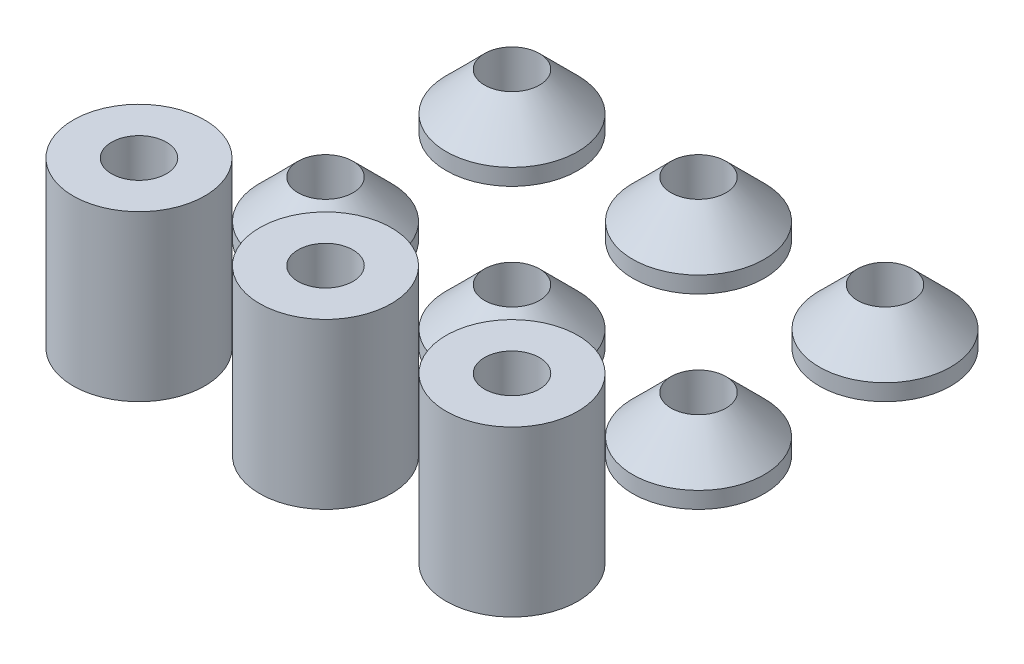
ISO-10303-21;
HEADER;
FILE_DESCRIPTION(('STEP AP214'),'2;1');
FILE_NAME('part.step','',(''),(''),'','','');
FILE_SCHEMA(('AUTOMOTIVE_DESIGN { 1 0 10303 214 1 1 1 1 }'));
ENDSEC;
DATA;
#1=APPLICATION_CONTEXT('core data for automotive mechanical design processes');
#2=APPLICATION_PROTOCOL_DEFINITION('international standard','automotive_design',2000,#1);
#3=PRODUCT_CONTEXT('',#1,'mechanical');
#4=PRODUCT('Part','Part','',(#3));
#5=PRODUCT_RELATED_PRODUCT_CATEGORY('part','',(#4));
#6=PRODUCT_DEFINITION_FORMATION('','',#4);
#7=PRODUCT_DEFINITION_CONTEXT('part definition',#1,'design');
#8=PRODUCT_DEFINITION('design','',#6,#7);
#9=PRODUCT_DEFINITION_SHAPE('','',#8);
#10=(LENGTH_UNIT() NAMED_UNIT(*) SI_UNIT(.MILLI.,.METRE.));
#11=(NAMED_UNIT(*) PLANE_ANGLE_UNIT() SI_UNIT($,.RADIAN.));
#12=(NAMED_UNIT(*) SI_UNIT($,.STERADIAN.) SOLID_ANGLE_UNIT());
#13=UNCERTAINTY_MEASURE_WITH_UNIT(LENGTH_MEASURE(1.E-05),#10,'distance_accuracy_value','');
#14=(GEOMETRIC_REPRESENTATION_CONTEXT(3) GLOBAL_UNCERTAINTY_ASSIGNED_CONTEXT((#13)) GLOBAL_UNIT_ASSIGNED_CONTEXT((#10,
#11,#12)) REPRESENTATION_CONTEXT('',''));
#15=CARTESIAN_POINT('',(0.,0.,0.));
#16=DIRECTION('',(0.,0.,1.));
#17=DIRECTION('',(1.,0.,0.));
#18=AXIS2_PLACEMENT_3D('',#15,#16,#17);
#19=CARTESIAN_POINT('',(20.4780084249292,15.,34.));
#20=DIRECTION('',(0.,1.,0.));
#21=DIRECTION('',(0.,0.,1.));
#22=AXIS2_PLACEMENT_3D('',#19,#20,#21);
#23=PLANE('',#22);
#24=CARTESIAN_POINT('',(20.4780084249292,15.,34.));
#25=DIRECTION('',(0.,1.,0.));
#26=DIRECTION('',(0.,0.,1.));
#27=AXIS2_PLACEMENT_3D('',#24,#25,#26);
#28=CIRCLE('',#27,6.);
#29=CARTESIAN_POINT('',(20.4780084249292,15.,40.));
#30=VERTEX_POINT('',#29);
#31=EDGE_CURVE('E11',#30,#30,#28,.T.);
#32=ORIENTED_EDGE('',*,*,#31,.T.);
#33=EDGE_LOOP('',(#32));
#34=FACE_BOUND('',#33,.T.);
#35=CARTESIAN_POINT('',(20.4780084249292,15.,34.));
#36=DIRECTION('',(0.,1.,0.));
#37=DIRECTION('',(0.,0.,1.));
#38=AXIS2_PLACEMENT_3D('',#35,#36,#37);
#39=CIRCLE('',#38,2.5);
#40=CARTESIAN_POINT('',(20.4780084249292,15.,36.5));
#41=VERTEX_POINT('',#40);
#42=EDGE_CURVE('E57',#41,#41,#39,.T.);
#43=ORIENTED_EDGE('',*,*,#42,.F.);
#44=EDGE_LOOP('',(#43));
#45=FACE_BOUND('',#44,.T.);
#46=ADVANCED_FACE('F46',(#34,#45),#23,.T.);
#47=CARTESIAN_POINT('',(20.4780084249292,0.,34.));
#48=DIRECTION('',(0.,1.,0.));
#49=DIRECTION('',(0.,0.,1.));
#50=AXIS2_PLACEMENT_3D('',#47,#48,#49);
#51=PLANE('',#50);
#52=CARTESIAN_POINT('',(20.4780084249292,0.,34.));
#53=DIRECTION('',(0.,1.,0.));
#54=DIRECTION('',(0.,0.,1.));
#55=AXIS2_PLACEMENT_3D('',#52,#53,#54);
#56=CIRCLE('',#55,6.);
#57=CARTESIAN_POINT('',(20.4780084249292,0.,40.));
#58=VERTEX_POINT('',#57);
#59=EDGE_CURVE('E50',#58,#58,#56,.T.);
#60=ORIENTED_EDGE('',*,*,#59,.F.);
#61=EDGE_LOOP('',(#60));
#62=FACE_BOUND('',#61,.T.);
#63=CARTESIAN_POINT('',(20.4780084249292,0.,34.));
#64=DIRECTION('',(0.,1.,0.));
#65=DIRECTION('',(0.,0.,1.));
#66=AXIS2_PLACEMENT_3D('',#63,#64,#65);
#67=CIRCLE('',#66,2.5);
#68=CARTESIAN_POINT('',(20.4780084249292,0.,36.5));
#69=VERTEX_POINT('',#68);
#70=EDGE_CURVE('E59',#69,#69,#67,.T.);
#71=ORIENTED_EDGE('',*,*,#70,.T.);
#72=EDGE_LOOP('',(#71));
#73=FACE_BOUND('',#72,.T.);
#74=ADVANCED_FACE('F69',(#62,#73),#51,.F.);
#75=CARTESIAN_POINT('',(20.4780084249292,15.,34.));
#76=DIRECTION('',(0.,-1.,0.));
#77=DIRECTION('',(0.,0.,-1.));
#78=AXIS2_PLACEMENT_3D('',#75,#76,#77);
#79=CYLINDRICAL_SURFACE('',#78,6.);
#80=ORIENTED_EDGE('',*,*,#31,.F.);
#81=EDGE_LOOP('',(#80));
#82=FACE_BOUND('',#81,.T.);
#83=ORIENTED_EDGE('',*,*,#59,.T.);
#84=EDGE_LOOP('',(#83));
#85=FACE_BOUND('',#84,.T.);
#86=ADVANCED_FACE('F48',(#82,#85),#79,.T.);
#87=CARTESIAN_POINT('',(20.4780084249292,15.,34.));
#88=DIRECTION('',(0.,-1.,0.));
#89=DIRECTION('',(0.,0.,-1.));
#90=AXIS2_PLACEMENT_3D('',#87,#88,#89);
#91=CYLINDRICAL_SURFACE('',#90,2.5);
#92=ORIENTED_EDGE('',*,*,#42,.T.);
#93=EDGE_LOOP('',(#92));
#94=FACE_BOUND('',#93,.T.);
#95=ORIENTED_EDGE('',*,*,#70,.F.);
#96=EDGE_LOOP('',(#95));
#97=FACE_BOUND('',#96,.T.);
#98=ADVANCED_FACE('F65',(#94,#97),#91,.F.);
#99=CLOSED_SHELL('',(#46,#74,#86,#98));
#100=MANIFOLD_SOLID_BREP('B2',#99);
#101=CARTESIAN_POINT('',(3.47800842492918,15.,34.));
#102=DIRECTION('',(0.,1.,0.));
#103=DIRECTION('',(0.,0.,1.));
#104=AXIS2_PLACEMENT_3D('',#101,#102,#103);
#105=PLANE('',#104);
#106=CARTESIAN_POINT('',(3.47800842492918,15.,34.));
#107=DIRECTION('',(0.,1.,0.));
#108=DIRECTION('',(0.,0.,1.));
#109=AXIS2_PLACEMENT_3D('',#106,#107,#108);
#110=CIRCLE('',#109,6.);
#111=CARTESIAN_POINT('',(3.47800842492918,15.,40.));
#112=VERTEX_POINT('',#111);
#113=EDGE_CURVE('E45',#112,#112,#110,.T.);
#114=ORIENTED_EDGE('',*,*,#113,.T.);
#115=EDGE_LOOP('',(#114));
#116=FACE_BOUND('',#115,.T.);
#117=CARTESIAN_POINT('',(3.47800842492918,15.,34.));
#118=DIRECTION('',(0.,1.,0.));
#119=DIRECTION('',(0.,0.,1.));
#120=AXIS2_PLACEMENT_3D('',#117,#118,#119);
#121=CIRCLE('',#120,2.5);
#122=CARTESIAN_POINT('',(3.47800842492918,15.,36.5));
#123=VERTEX_POINT('',#122);
#124=EDGE_CURVE('E129',#123,#123,#121,.T.);
#125=ORIENTED_EDGE('',*,*,#124,.F.);
#126=EDGE_LOOP('',(#125));
#127=FACE_BOUND('',#126,.T.);
#128=ADVANCED_FACE('F116',(#116,#127),#105,.T.);
#129=CARTESIAN_POINT('',(3.47800842492918,0.,34.));
#130=DIRECTION('',(0.,1.,0.));
#131=DIRECTION('',(0.,0.,1.));
#132=AXIS2_PLACEMENT_3D('',#129,#130,#131);
#133=PLANE('',#132);
#134=CARTESIAN_POINT('',(3.47800842492918,0.,34.));
#135=DIRECTION('',(0.,1.,0.));
#136=DIRECTION('',(0.,0.,1.));
#137=AXIS2_PLACEMENT_3D('',#134,#135,#136);
#138=CIRCLE('',#137,6.);
#139=CARTESIAN_POINT('',(3.47800842492918,0.,40.));
#140=VERTEX_POINT('',#139);
#141=EDGE_CURVE('E120',#140,#140,#138,.T.);
#142=ORIENTED_EDGE('',*,*,#141,.F.);
#143=EDGE_LOOP('',(#142));
#144=FACE_BOUND('',#143,.T.);
#145=CARTESIAN_POINT('',(3.47800842492918,0.,34.));
#146=DIRECTION('',(0.,1.,0.));
#147=DIRECTION('',(0.,0.,1.));
#148=AXIS2_PLACEMENT_3D('',#145,#146,#147);
#149=CIRCLE('',#148,2.5);
#150=CARTESIAN_POINT('',(3.47800842492918,0.,36.5));
#151=VERTEX_POINT('',#150);
#152=EDGE_CURVE('E131',#151,#151,#149,.T.);
#153=ORIENTED_EDGE('',*,*,#152,.T.);
#154=EDGE_LOOP('',(#153));
#155=FACE_BOUND('',#154,.T.);
#156=ADVANCED_FACE('F143',(#144,#155),#133,.F.);
#157=CARTESIAN_POINT('',(3.47800842492918,15.,34.));
#158=DIRECTION('',(0.,-1.,0.));
#159=DIRECTION('',(0.,0.,-1.));
#160=AXIS2_PLACEMENT_3D('',#157,#158,#159);
#161=CYLINDRICAL_SURFACE('',#160,6.);
#162=ORIENTED_EDGE('',*,*,#113,.F.);
#163=EDGE_LOOP('',(#162));
#164=FACE_BOUND('',#163,.T.);
#165=ORIENTED_EDGE('',*,*,#141,.T.);
#166=EDGE_LOOP('',(#165));
#167=FACE_BOUND('',#166,.T.);
#168=ADVANCED_FACE('F118',(#164,#167),#161,.T.);
#169=CARTESIAN_POINT('',(3.47800842492918,15.,34.));
#170=DIRECTION('',(0.,-1.,0.));
#171=DIRECTION('',(0.,0.,-1.));
#172=AXIS2_PLACEMENT_3D('',#169,#170,#171);
#173=CYLINDRICAL_SURFACE('',#172,2.5);
#174=ORIENTED_EDGE('',*,*,#124,.T.);
#175=EDGE_LOOP('',(#174));
#176=FACE_BOUND('',#175,.T.);
#177=ORIENTED_EDGE('',*,*,#152,.F.);
#178=EDGE_LOOP('',(#177));
#179=FACE_BOUND('',#178,.T.);
#180=ADVANCED_FACE('F139',(#176,#179),#173,.F.);
#181=CLOSED_SHELL('',(#128,#156,#168,#180));
#182=MANIFOLD_SOLID_BREP('B6',#181);
#183=CARTESIAN_POINT('',(-13.5219915750708,15.,34.));
#184=DIRECTION('',(0.,1.,0.));
#185=DIRECTION('',(0.,0.,1.));
#186=AXIS2_PLACEMENT_3D('',#183,#184,#185);
#187=PLANE('',#186);
#188=CARTESIAN_POINT('',(-13.5219915750708,15.,34.));
#189=DIRECTION('',(0.,1.,0.));
#190=DIRECTION('',(0.,0.,1.));
#191=AXIS2_PLACEMENT_3D('',#188,#189,#190);
#192=CIRCLE('',#191,6.);
#193=CARTESIAN_POINT('',(-13.5219915750708,15.,40.));
#194=VERTEX_POINT('',#193);
#195=EDGE_CURVE('E115',#194,#194,#192,.T.);
#196=ORIENTED_EDGE('',*,*,#195,.T.);
#197=EDGE_LOOP('',(#196));
#198=FACE_BOUND('',#197,.T.);
#199=CARTESIAN_POINT('',(-13.5219915750708,15.,34.));
#200=DIRECTION('',(0.,1.,0.));
#201=DIRECTION('',(0.,0.,1.));
#202=AXIS2_PLACEMENT_3D('',#199,#200,#201);
#203=CIRCLE('',#202,2.5);
#204=CARTESIAN_POINT('',(-13.5219915750708,15.,36.5));
#205=VERTEX_POINT('',#204);
#206=EDGE_CURVE('E201',#205,#205,#203,.T.);
#207=ORIENTED_EDGE('',*,*,#206,.F.);
#208=EDGE_LOOP('',(#207));
#209=FACE_BOUND('',#208,.T.);
#210=ADVANCED_FACE('F190',(#198,#209),#187,.T.);
#211=CARTESIAN_POINT('',(-13.5219915750708,0.,34.));
#212=DIRECTION('',(0.,1.,0.));
#213=DIRECTION('',(0.,0.,1.));
#214=AXIS2_PLACEMENT_3D('',#211,#212,#213);
#215=PLANE('',#214);
#216=CARTESIAN_POINT('',(-13.5219915750708,0.,34.));
#217=DIRECTION('',(0.,1.,0.));
#218=DIRECTION('',(0.,0.,1.));
#219=AXIS2_PLACEMENT_3D('',#216,#217,#218);
#220=CIRCLE('',#219,6.);
#221=CARTESIAN_POINT('',(-13.5219915750708,0.,40.));
#222=VERTEX_POINT('',#221);
#223=EDGE_CURVE('E194',#222,#222,#220,.T.);
#224=ORIENTED_EDGE('',*,*,#223,.F.);
#225=EDGE_LOOP('',(#224));
#226=FACE_BOUND('',#225,.T.);
#227=CARTESIAN_POINT('',(-13.5219915750708,0.,34.));
#228=DIRECTION('',(0.,1.,0.));
#229=DIRECTION('',(0.,0.,1.));
#230=AXIS2_PLACEMENT_3D('',#227,#228,#229);
#231=CIRCLE('',#230,2.5);
#232=CARTESIAN_POINT('',(-13.5219915750708,0.,36.5));
#233=VERTEX_POINT('',#232);
#234=EDGE_CURVE('E203',#233,#233,#231,.T.);
#235=ORIENTED_EDGE('',*,*,#234,.T.);
#236=EDGE_LOOP('',(#235));
#237=FACE_BOUND('',#236,.T.);
#238=ADVANCED_FACE('F213',(#226,#237),#215,.F.);
#239=CARTESIAN_POINT('',(-13.5219915750708,15.,34.));
#240=DIRECTION('',(0.,-1.,0.));
#241=DIRECTION('',(0.,0.,-1.));
#242=AXIS2_PLACEMENT_3D('',#239,#240,#241);
#243=CYLINDRICAL_SURFACE('',#242,6.);
#244=ORIENTED_EDGE('',*,*,#195,.F.);
#245=EDGE_LOOP('',(#244));
#246=FACE_BOUND('',#245,.T.);
#247=ORIENTED_EDGE('',*,*,#223,.T.);
#248=EDGE_LOOP('',(#247));
#249=FACE_BOUND('',#248,.T.);
#250=ADVANCED_FACE('F192',(#246,#249),#243,.T.);
#251=CARTESIAN_POINT('',(-13.5219915750708,15.,34.));
#252=DIRECTION('',(0.,-1.,0.));
#253=DIRECTION('',(0.,0.,-1.));
#254=AXIS2_PLACEMENT_3D('',#251,#252,#253);
#255=CYLINDRICAL_SURFACE('',#254,2.5);
#256=ORIENTED_EDGE('',*,*,#206,.T.);
#257=EDGE_LOOP('',(#256));
#258=FACE_BOUND('',#257,.T.);
#259=ORIENTED_EDGE('',*,*,#234,.F.);
#260=EDGE_LOOP('',(#259));
#261=FACE_BOUND('',#260,.T.);
#262=ADVANCED_FACE('F209',(#258,#261),#255,.F.);
#263=CLOSED_SHELL('',(#210,#238,#250,#262));
#264=MANIFOLD_SOLID_BREP('B40',#263);
#265=CARTESIAN_POINT('',(20.4780084249292,4.,17.));
#266=DIRECTION('',(0.,-1.,0.));
#267=DIRECTION('',(0.,0.,-1.));
#268=AXIS2_PLACEMENT_3D('',#265,#266,#267);
#269=CYLINDRICAL_SURFACE('',#268,6.);
#270=CARTESIAN_POINT('',(20.4780084249292,0.,17.));
#271=DIRECTION('',(0.,1.,0.));
#272=DIRECTION('',(0.,0.,1.));
#273=AXIS2_PLACEMENT_3D('',#270,#271,#272);
#274=CIRCLE('',#273,6.);
#275=CARTESIAN_POINT('',(20.4780084249292,0.,23.));
#276=VERTEX_POINT('',#275);
#277=EDGE_CURVE('E189',#276,#276,#274,.T.);
#278=ORIENTED_EDGE('',*,*,#277,.T.);
#279=EDGE_LOOP('',(#278));
#280=FACE_BOUND('',#279,.T.);
#281=CARTESIAN_POINT('',(20.4780084249292,1.5,17.));
#282=DIRECTION('',(0.,-1.,0.));
#283=DIRECTION('',(0.,0.,-1.));
#284=AXIS2_PLACEMENT_3D('',#281,#282,#283);
#285=CIRCLE('',#284,6.);
#286=CARTESIAN_POINT('',(20.4780084249292,1.5,11.));
#287=VERTEX_POINT('',#286);
#288=EDGE_CURVE('E273',#287,#287,#285,.T.);
#289=ORIENTED_EDGE('',*,*,#288,.T.);
#290=EDGE_LOOP('',(#289));
#291=FACE_BOUND('',#290,.T.);
#292=ADVANCED_FACE('F259',(#280,#291),#269,.T.);
#293=CARTESIAN_POINT('',(20.4780084249292,0.,17.));
#294=DIRECTION('',(0.,1.,0.));
#295=DIRECTION('',(0.,0.,1.));
#296=AXIS2_PLACEMENT_3D('',#293,#294,#295);
#297=PLANE('',#296);
#298=CARTESIAN_POINT('',(20.4780084249292,0.,17.));
#299=DIRECTION('',(0.,1.,0.));
#300=DIRECTION('',(0.,0.,1.));
#301=AXIS2_PLACEMENT_3D('',#298,#299,#300);
#302=CIRCLE('',#301,2.5);
#303=CARTESIAN_POINT('',(20.4780084249292,0.,19.5));
#304=VERTEX_POINT('',#303);
#305=EDGE_CURVE('E265',#304,#304,#302,.T.);
#306=ORIENTED_EDGE('',*,*,#305,.T.);
#307=EDGE_LOOP('',(#306));
#308=FACE_BOUND('',#307,.T.);
#309=ORIENTED_EDGE('',*,*,#277,.F.);
#310=EDGE_LOOP('',(#309));
#311=FACE_BOUND('',#310,.T.);
#312=ADVANCED_FACE('F288',(#308,#311),#297,.F.);
#313=CARTESIAN_POINT('',(20.4780084249292,0.,17.));
#314=DIRECTION('',(0.,1.,0.));
#315=DIRECTION('',(0.,0.,1.));
#316=AXIS2_PLACEMENT_3D('',#313,#314,#315);
#317=CYLINDRICAL_SURFACE('',#316,2.5);
#318=ORIENTED_EDGE('',*,*,#305,.F.);
#319=EDGE_LOOP('',(#318));
#320=FACE_BOUND('',#319,.T.);
#321=CARTESIAN_POINT('',(20.4780084249292,5.,17.));
#322=DIRECTION('',(0.,-1.,0.));
#323=DIRECTION('',(0.,0.,-1.));
#324=AXIS2_PLACEMENT_3D('',#321,#322,#323);
#325=CIRCLE('',#324,2.5);
#326=CARTESIAN_POINT('',(20.4780084249292,5.,14.5));
#327=VERTEX_POINT('',#326);
#328=EDGE_CURVE('E269',#327,#327,#325,.T.);
#329=ORIENTED_EDGE('',*,*,#328,.F.);
#330=EDGE_LOOP('',(#329));
#331=FACE_BOUND('',#330,.T.);
#332=ADVANCED_FACE('F282',(#320,#331),#317,.F.);
#333=CARTESIAN_POINT('',(20.4780084249292,1.5,17.));
#334=DIRECTION('',(0.,-1.,0.));
#335=DIRECTION('',(0.,0.,-1.));
#336=AXIS2_PLACEMENT_3D('',#333,#334,#335);
#337=CONICAL_SURFACE('',#336,6.,0.785398163397449);
#338=ORIENTED_EDGE('',*,*,#328,.T.);
#339=EDGE_LOOP('',(#338));
#340=FACE_BOUND('',#339,.T.);
#341=ORIENTED_EDGE('',*,*,#288,.F.);
#342=EDGE_LOOP('',(#341));
#343=FACE_BOUND('',#342,.T.);
#344=ADVANCED_FACE('F280',(#340,#343),#337,.T.);
#345=CLOSED_SHELL('',(#292,#312,#332,#344));
#346=MANIFOLD_SOLID_BREP('B110',#345);
#347=CARTESIAN_POINT('',(3.47800842492918,4.,17.));
#348=DIRECTION('',(0.,-1.,0.));
#349=DIRECTION('',(0.,0.,-1.));
#350=AXIS2_PLACEMENT_3D('',#347,#348,#349);
#351=CYLINDRICAL_SURFACE('',#350,6.);
#352=CARTESIAN_POINT('',(3.47800842492918,0.,17.));
#353=DIRECTION('',(0.,1.,0.));
#354=DIRECTION('',(0.,0.,1.));
#355=AXIS2_PLACEMENT_3D('',#352,#353,#354);
#356=CIRCLE('',#355,6.);
#357=CARTESIAN_POINT('',(3.47800842492918,0.,23.));
#358=VERTEX_POINT('',#357);
#359=EDGE_CURVE('E258',#358,#358,#356,.T.);
#360=ORIENTED_EDGE('',*,*,#359,.T.);
#361=EDGE_LOOP('',(#360));
#362=FACE_BOUND('',#361,.T.);
#363=CARTESIAN_POINT('',(3.47800842492918,1.5,17.));
#364=DIRECTION('',(0.,-1.,0.));
#365=DIRECTION('',(0.,0.,-1.));
#366=AXIS2_PLACEMENT_3D('',#363,#364,#365);
#367=CIRCLE('',#366,6.);
#368=CARTESIAN_POINT('',(3.47800842492918,1.5,11.));
#369=VERTEX_POINT('',#368);
#370=EDGE_CURVE('E345',#369,#369,#367,.T.);
#371=ORIENTED_EDGE('',*,*,#370,.T.);
#372=EDGE_LOOP('',(#371));
#373=FACE_BOUND('',#372,.T.);
#374=ADVANCED_FACE('F331',(#362,#373),#351,.T.);
#375=CARTESIAN_POINT('',(3.47800842492918,0.,17.));
#376=DIRECTION('',(0.,1.,0.));
#377=DIRECTION('',(0.,0.,1.));
#378=AXIS2_PLACEMENT_3D('',#375,#376,#377);
#379=PLANE('',#378);
#380=CARTESIAN_POINT('',(3.47800842492918,0.,17.));
#381=DIRECTION('',(0.,1.,0.));
#382=DIRECTION('',(0.,0.,1.));
#383=AXIS2_PLACEMENT_3D('',#380,#381,#382);
#384=CIRCLE('',#383,2.5);
#385=CARTESIAN_POINT('',(3.47800842492918,0.,19.5));
#386=VERTEX_POINT('',#385);
#387=EDGE_CURVE('E337',#386,#386,#384,.T.);
#388=ORIENTED_EDGE('',*,*,#387,.T.);
#389=EDGE_LOOP('',(#388));
#390=FACE_BOUND('',#389,.T.);
#391=ORIENTED_EDGE('',*,*,#359,.F.);
#392=EDGE_LOOP('',(#391));
#393=FACE_BOUND('',#392,.T.);
#394=ADVANCED_FACE('F360',(#390,#393),#379,.F.);
#395=CARTESIAN_POINT('',(3.47800842492918,0.,17.));
#396=DIRECTION('',(0.,1.,0.));
#397=DIRECTION('',(0.,0.,1.));
#398=AXIS2_PLACEMENT_3D('',#395,#396,#397);
#399=CYLINDRICAL_SURFACE('',#398,2.5);
#400=ORIENTED_EDGE('',*,*,#387,.F.);
#401=EDGE_LOOP('',(#400));
#402=FACE_BOUND('',#401,.T.);
#403=CARTESIAN_POINT('',(3.47800842492918,5.,17.));
#404=DIRECTION('',(0.,-1.,0.));
#405=DIRECTION('',(0.,0.,-1.));
#406=AXIS2_PLACEMENT_3D('',#403,#404,#405);
#407=CIRCLE('',#406,2.5);
#408=CARTESIAN_POINT('',(3.47800842492918,5.,14.5));
#409=VERTEX_POINT('',#408);
#410=EDGE_CURVE('E341',#409,#409,#407,.T.);
#411=ORIENTED_EDGE('',*,*,#410,.F.);
#412=EDGE_LOOP('',(#411));
#413=FACE_BOUND('',#412,.T.);
#414=ADVANCED_FACE('F354',(#402,#413),#399,.F.);
#415=CARTESIAN_POINT('',(3.47800842492918,1.5,17.));
#416=DIRECTION('',(0.,-1.,0.));
#417=DIRECTION('',(0.,0.,-1.));
#418=AXIS2_PLACEMENT_3D('',#415,#416,#417);
#419=CONICAL_SURFACE('',#418,6.,0.785398163397449);
#420=ORIENTED_EDGE('',*,*,#410,.T.);
#421=EDGE_LOOP('',(#420));
#422=FACE_BOUND('',#421,.T.);
#423=ORIENTED_EDGE('',*,*,#370,.F.);
#424=EDGE_LOOP('',(#423));
#425=FACE_BOUND('',#424,.T.);
#426=ADVANCED_FACE('F352',(#422,#425),#419,.T.);
#427=CLOSED_SHELL('',(#374,#394,#414,#426));
#428=MANIFOLD_SOLID_BREP('B184',#427);
#429=CARTESIAN_POINT('',(-13.5219915750708,4.,17.));
#430=DIRECTION('',(0.,-1.,0.));
#431=DIRECTION('',(0.,0.,-1.));
#432=AXIS2_PLACEMENT_3D('',#429,#430,#431);
#433=CYLINDRICAL_SURFACE('',#432,6.);
#434=CARTESIAN_POINT('',(-13.5219915750708,0.,17.));
#435=DIRECTION('',(0.,1.,0.));
#436=DIRECTION('',(0.,0.,1.));
#437=AXIS2_PLACEMENT_3D('',#434,#435,#436);
#438=CIRCLE('',#437,6.);
#439=CARTESIAN_POINT('',(-13.5219915750708,0.,23.));
#440=VERTEX_POINT('',#439);
#441=EDGE_CURVE('E330',#440,#440,#438,.T.);
#442=ORIENTED_EDGE('',*,*,#441,.T.);
#443=EDGE_LOOP('',(#442));
#444=FACE_BOUND('',#443,.T.);
#445=CARTESIAN_POINT('',(-13.5219915750708,1.5,17.));
#446=DIRECTION('',(0.,-1.,0.));
#447=DIRECTION('',(0.,0.,-1.));
#448=AXIS2_PLACEMENT_3D('',#445,#446,#447);
#449=CIRCLE('',#448,6.);
#450=CARTESIAN_POINT('',(-13.5219915750708,1.5,11.));
#451=VERTEX_POINT('',#450);
#452=EDGE_CURVE('E417',#451,#451,#449,.T.);
#453=ORIENTED_EDGE('',*,*,#452,.T.);
#454=EDGE_LOOP('',(#453));
#455=FACE_BOUND('',#454,.T.);
#456=ADVANCED_FACE('F403',(#444,#455),#433,.T.);
#457=CARTESIAN_POINT('',(-13.5219915750708,0.,17.));
#458=DIRECTION('',(0.,1.,0.));
#459=DIRECTION('',(0.,0.,1.));
#460=AXIS2_PLACEMENT_3D('',#457,#458,#459);
#461=PLANE('',#460);
#462=CARTESIAN_POINT('',(-13.5219915750708,0.,17.));
#463=DIRECTION('',(0.,1.,0.));
#464=DIRECTION('',(0.,0.,1.));
#465=AXIS2_PLACEMENT_3D('',#462,#463,#464);
#466=CIRCLE('',#465,2.5);
#467=CARTESIAN_POINT('',(-13.5219915750708,0.,19.5));
#468=VERTEX_POINT('',#467);
#469=EDGE_CURVE('E409',#468,#468,#466,.T.);
#470=ORIENTED_EDGE('',*,*,#469,.T.);
#471=EDGE_LOOP('',(#470));
#472=FACE_BOUND('',#471,.T.);
#473=ORIENTED_EDGE('',*,*,#441,.F.);
#474=EDGE_LOOP('',(#473));
#475=FACE_BOUND('',#474,.T.);
#476=ADVANCED_FACE('F432',(#472,#475),#461,.F.);
#477=CARTESIAN_POINT('',(-13.5219915750708,0.,17.));
#478=DIRECTION('',(0.,1.,0.));
#479=DIRECTION('',(0.,0.,1.));
#480=AXIS2_PLACEMENT_3D('',#477,#478,#479);
#481=CYLINDRICAL_SURFACE('',#480,2.5);
#482=ORIENTED_EDGE('',*,*,#469,.F.);
#483=EDGE_LOOP('',(#482));
#484=FACE_BOUND('',#483,.T.);
#485=CARTESIAN_POINT('',(-13.5219915750708,5.,17.));
#486=DIRECTION('',(0.,-1.,0.));
#487=DIRECTION('',(0.,0.,-1.));
#488=AXIS2_PLACEMENT_3D('',#485,#486,#487);
#489=CIRCLE('',#488,2.5);
#490=CARTESIAN_POINT('',(-13.5219915750708,5.,14.5));
#491=VERTEX_POINT('',#490);
#492=EDGE_CURVE('E413',#491,#491,#489,.T.);
#493=ORIENTED_EDGE('',*,*,#492,.F.);
#494=EDGE_LOOP('',(#493));
#495=FACE_BOUND('',#494,.T.);
#496=ADVANCED_FACE('F426',(#484,#495),#481,.F.);
#497=CARTESIAN_POINT('',(-13.5219915750708,1.5,17.));
#498=DIRECTION('',(0.,-1.,0.));
#499=DIRECTION('',(0.,0.,-1.));
#500=AXIS2_PLACEMENT_3D('',#497,#498,#499);
#501=CONICAL_SURFACE('',#500,6.,0.785398163397449);
#502=ORIENTED_EDGE('',*,*,#492,.T.);
#503=EDGE_LOOP('',(#502));
#504=FACE_BOUND('',#503,.T.);
#505=ORIENTED_EDGE('',*,*,#452,.F.);
#506=EDGE_LOOP('',(#505));
#507=FACE_BOUND('',#506,.T.);
#508=ADVANCED_FACE('F424',(#504,#507),#501,.T.);
#509=CLOSED_SHELL('',(#456,#476,#496,#508));
#510=MANIFOLD_SOLID_BREP('B253',#509);
#511=CARTESIAN_POINT('',(20.4780084249292,4.,0.));
#512=DIRECTION('',(0.,-1.,0.));
#513=DIRECTION('',(0.,0.,-1.));
#514=AXIS2_PLACEMENT_3D('',#511,#512,#513);
#515=CYLINDRICAL_SURFACE('',#514,6.);
#516=CARTESIAN_POINT('',(20.4780084249292,0.,0.));
#517=DIRECTION('',(0.,1.,0.));
#518=DIRECTION('',(0.,0.,1.));
#519=AXIS2_PLACEMENT_3D('',#516,#517,#518);
#520=CIRCLE('',#519,6.);
#521=CARTESIAN_POINT('',(20.4780084249292,0.,6.));
#522=VERTEX_POINT('',#521);
#523=EDGE_CURVE('E402',#522,#522,#520,.T.);
#524=ORIENTED_EDGE('',*,*,#523,.T.);
#525=EDGE_LOOP('',(#524));
#526=FACE_BOUND('',#525,.T.);
#527=CARTESIAN_POINT('',(20.4780084249292,1.5,0.));
#528=DIRECTION('',(0.,-1.,0.));
#529=DIRECTION('',(0.,0.,-1.));
#530=AXIS2_PLACEMENT_3D('',#527,#528,#529);
#531=CIRCLE('',#530,6.);
#532=CARTESIAN_POINT('',(20.4780084249292,1.5,-6.));
#533=VERTEX_POINT('',#532);
#534=EDGE_CURVE('E489',#533,#533,#531,.T.);
#535=ORIENTED_EDGE('',*,*,#534,.T.);
#536=EDGE_LOOP('',(#535));
#537=FACE_BOUND('',#536,.T.);
#538=ADVANCED_FACE('F475',(#526,#537),#515,.T.);
#539=CARTESIAN_POINT('',(20.4780084249292,0.,0.));
#540=DIRECTION('',(0.,1.,0.));
#541=DIRECTION('',(0.,0.,1.));
#542=AXIS2_PLACEMENT_3D('',#539,#540,#541);
#543=PLANE('',#542);
#544=CARTESIAN_POINT('',(20.4780084249292,0.,0.));
#545=DIRECTION('',(0.,1.,0.));
#546=DIRECTION('',(0.,0.,1.));
#547=AXIS2_PLACEMENT_3D('',#544,#545,#546);
#548=CIRCLE('',#547,2.5);
#549=CARTESIAN_POINT('',(20.4780084249292,0.,2.5));
#550=VERTEX_POINT('',#549);
#551=EDGE_CURVE('E481',#550,#550,#548,.T.);
#552=ORIENTED_EDGE('',*,*,#551,.T.);
#553=EDGE_LOOP('',(#552));
#554=FACE_BOUND('',#553,.T.);
#555=ORIENTED_EDGE('',*,*,#523,.F.);
#556=EDGE_LOOP('',(#555));
#557=FACE_BOUND('',#556,.T.);
#558=ADVANCED_FACE('F504',(#554,#557),#543,.F.);
#559=CARTESIAN_POINT('',(20.4780084249292,0.,0.));
#560=DIRECTION('',(0.,1.,0.));
#561=DIRECTION('',(0.,0.,1.));
#562=AXIS2_PLACEMENT_3D('',#559,#560,#561);
#563=CYLINDRICAL_SURFACE('',#562,2.5);
#564=ORIENTED_EDGE('',*,*,#551,.F.);
#565=EDGE_LOOP('',(#564));
#566=FACE_BOUND('',#565,.T.);
#567=CARTESIAN_POINT('',(20.4780084249292,5.,0.));
#568=DIRECTION('',(0.,-1.,0.));
#569=DIRECTION('',(0.,0.,-1.));
#570=AXIS2_PLACEMENT_3D('',#567,#568,#569);
#571=CIRCLE('',#570,2.5);
#572=CARTESIAN_POINT('',(20.4780084249292,5.,-2.5));
#573=VERTEX_POINT('',#572);
#574=EDGE_CURVE('E485',#573,#573,#571,.T.);
#575=ORIENTED_EDGE('',*,*,#574,.F.);
#576=EDGE_LOOP('',(#575));
#577=FACE_BOUND('',#576,.T.);
#578=ADVANCED_FACE('F498',(#566,#577),#563,.F.);
#579=CARTESIAN_POINT('',(20.4780084249292,1.5,0.));
#580=DIRECTION('',(0.,-1.,0.));
#581=DIRECTION('',(0.,0.,-1.));
#582=AXIS2_PLACEMENT_3D('',#579,#580,#581);
#583=CONICAL_SURFACE('',#582,6.,0.785398163397449);
#584=ORIENTED_EDGE('',*,*,#574,.T.);
#585=EDGE_LOOP('',(#584));
#586=FACE_BOUND('',#585,.T.);
#587=ORIENTED_EDGE('',*,*,#534,.F.);
#588=EDGE_LOOP('',(#587));
#589=FACE_BOUND('',#588,.T.);
#590=ADVANCED_FACE('F496',(#586,#589),#583,.T.);
#591=CLOSED_SHELL('',(#538,#558,#578,#590));
#592=MANIFOLD_SOLID_BREP('B325',#591);
#593=CARTESIAN_POINT('',(3.47800842492918,4.,0.));
#594=DIRECTION('',(0.,-1.,0.));
#595=DIRECTION('',(0.,0.,-1.));
#596=AXIS2_PLACEMENT_3D('',#593,#594,#595);
#597=CYLINDRICAL_SURFACE('',#596,6.);
#598=CARTESIAN_POINT('',(3.47800842492918,0.,0.));
#599=DIRECTION('',(0.,1.,0.));
#600=DIRECTION('',(0.,0.,1.));
#601=AXIS2_PLACEMENT_3D('',#598,#599,#600);
#602=CIRCLE('',#601,6.);
#603=CARTESIAN_POINT('',(3.47800842492918,0.,6.));
#604=VERTEX_POINT('',#603);
#605=EDGE_CURVE('E474',#604,#604,#602,.T.);
#606=ORIENTED_EDGE('',*,*,#605,.T.);
#607=EDGE_LOOP('',(#606));
#608=FACE_BOUND('',#607,.T.);
#609=CARTESIAN_POINT('',(3.47800842492918,1.5,0.));
#610=DIRECTION('',(0.,-1.,0.));
#611=DIRECTION('',(0.,0.,-1.));
#612=AXIS2_PLACEMENT_3D('',#609,#610,#611);
#613=CIRCLE('',#612,6.);
#614=CARTESIAN_POINT('',(3.47800842492918,1.5,-6.));
#615=VERTEX_POINT('',#614);
#616=EDGE_CURVE('E560',#615,#615,#613,.T.);
#617=ORIENTED_EDGE('',*,*,#616,.T.);
#618=EDGE_LOOP('',(#617));
#619=FACE_BOUND('',#618,.T.);
#620=ADVANCED_FACE('F546',(#608,#619),#597,.T.);
#621=CARTESIAN_POINT('',(3.47800842492918,0.,0.));
#622=DIRECTION('',(0.,1.,0.));
#623=DIRECTION('',(0.,0.,1.));
#624=AXIS2_PLACEMENT_3D('',#621,#622,#623);
#625=PLANE('',#624);
#626=CARTESIAN_POINT('',(3.47800842492918,0.,0.));
#627=DIRECTION('',(0.,1.,0.));
#628=DIRECTION('',(0.,0.,1.));
#629=AXIS2_PLACEMENT_3D('',#626,#627,#628);
#630=CIRCLE('',#629,2.5);
#631=CARTESIAN_POINT('',(3.47800842492918,0.,2.5));
#632=VERTEX_POINT('',#631);
#633=EDGE_CURVE('E552',#632,#632,#630,.T.);
#634=ORIENTED_EDGE('',*,*,#633,.T.);
#635=EDGE_LOOP('',(#634));
#636=FACE_BOUND('',#635,.T.);
#637=ORIENTED_EDGE('',*,*,#605,.F.);
#638=EDGE_LOOP('',(#637));
#639=FACE_BOUND('',#638,.T.);
#640=ADVANCED_FACE('F575',(#636,#639),#625,.F.);
#641=CARTESIAN_POINT('',(3.47800842492918,0.,0.));
#642=DIRECTION('',(0.,1.,0.));
#643=DIRECTION('',(0.,0.,1.));
#644=AXIS2_PLACEMENT_3D('',#641,#642,#643);
#645=CYLINDRICAL_SURFACE('',#644,2.5);
#646=ORIENTED_EDGE('',*,*,#633,.F.);
#647=EDGE_LOOP('',(#646));
#648=FACE_BOUND('',#647,.T.);
#649=CARTESIAN_POINT('',(3.47800842492918,5.,0.));
#650=DIRECTION('',(0.,-1.,0.));
#651=DIRECTION('',(0.,0.,-1.));
#652=AXIS2_PLACEMENT_3D('',#649,#650,#651);
#653=CIRCLE('',#652,2.5);
#654=CARTESIAN_POINT('',(3.47800842492918,5.,-2.5));
#655=VERTEX_POINT('',#654);
#656=EDGE_CURVE('E556',#655,#655,#653,.T.);
#657=ORIENTED_EDGE('',*,*,#656,.F.);
#658=EDGE_LOOP('',(#657));
#659=FACE_BOUND('',#658,.T.);
#660=ADVANCED_FACE('F569',(#648,#659),#645,.F.);
#661=CARTESIAN_POINT('',(3.47800842492918,1.5,0.));
#662=DIRECTION('',(0.,-1.,0.));
#663=DIRECTION('',(0.,0.,-1.));
#664=AXIS2_PLACEMENT_3D('',#661,#662,#663);
#665=CONICAL_SURFACE('',#664,6.,0.785398163397449);
#666=ORIENTED_EDGE('',*,*,#656,.T.);
#667=EDGE_LOOP('',(#666));
#668=FACE_BOUND('',#667,.T.);
#669=ORIENTED_EDGE('',*,*,#616,.F.);
#670=EDGE_LOOP('',(#669));
#671=FACE_BOUND('',#670,.T.);
#672=ADVANCED_FACE('F567',(#668,#671),#665,.T.);
#673=CLOSED_SHELL('',(#620,#640,#660,#672));
#674=MANIFOLD_SOLID_BREP('B397',#673);
#675=CARTESIAN_POINT('',(-13.5219915750708,4.,0.));
#676=DIRECTION('',(0.,-1.,0.));
#677=DIRECTION('',(0.,0.,-1.));
#678=AXIS2_PLACEMENT_3D('',#675,#676,#677);
#679=CYLINDRICAL_SURFACE('',#678,6.);
#680=CARTESIAN_POINT('',(-13.5219915750708,0.,0.));
#681=DIRECTION('',(0.,1.,0.));
#682=DIRECTION('',(0.,0.,1.));
#683=AXIS2_PLACEMENT_3D('',#680,#681,#682);
#684=CIRCLE('',#683,6.);
#685=CARTESIAN_POINT('',(-13.5219915750708,0.,6.));
#686=VERTEX_POINT('',#685);
#687=EDGE_CURVE('E545',#686,#686,#684,.T.);
#688=ORIENTED_EDGE('',*,*,#687,.T.);
#689=EDGE_LOOP('',(#688));
#690=FACE_BOUND('',#689,.T.);
#691=CARTESIAN_POINT('',(-13.5219915750708,1.5,0.));
#692=DIRECTION('',(0.,-1.,0.));
#693=DIRECTION('',(0.,0.,-1.));
#694=AXIS2_PLACEMENT_3D('',#691,#692,#693);
#695=CIRCLE('',#694,6.);
#696=CARTESIAN_POINT('',(-13.5219915750708,1.5,-6.));
#697=VERTEX_POINT('',#696);
#698=EDGE_CURVE('E624',#697,#697,#695,.T.);
#699=ORIENTED_EDGE('',*,*,#698,.T.);
#700=EDGE_LOOP('',(#699));
#701=FACE_BOUND('',#700,.T.);
#702=ADVANCED_FACE('F610',(#690,#701),#679,.T.);
#703=CARTESIAN_POINT('',(-13.5219915750708,0.,0.));
#704=DIRECTION('',(0.,1.,0.));
#705=DIRECTION('',(0.,0.,1.));
#706=AXIS2_PLACEMENT_3D('',#703,#704,#705);
#707=PLANE('',#706);
#708=CARTESIAN_POINT('',(-13.5219915750708,0.,0.));
#709=DIRECTION('',(0.,1.,0.));
#710=DIRECTION('',(0.,0.,1.));
#711=AXIS2_PLACEMENT_3D('',#708,#709,#710);
#712=CIRCLE('',#711,2.5);
#713=CARTESIAN_POINT('',(-13.5219915750708,0.,2.5));
#714=VERTEX_POINT('',#713);
#715=EDGE_CURVE('E616',#714,#714,#712,.T.);
#716=ORIENTED_EDGE('',*,*,#715,.T.);
#717=EDGE_LOOP('',(#716));
#718=FACE_BOUND('',#717,.T.);
#719=ORIENTED_EDGE('',*,*,#687,.F.);
#720=EDGE_LOOP('',(#719));
#721=FACE_BOUND('',#720,.T.);
#722=ADVANCED_FACE('F639',(#718,#721),#707,.F.);
#723=CARTESIAN_POINT('',(-13.5219915750708,0.,0.));
#724=DIRECTION('',(0.,1.,0.));
#725=DIRECTION('',(0.,0.,1.));
#726=AXIS2_PLACEMENT_3D('',#723,#724,#725);
#727=CYLINDRICAL_SURFACE('',#726,2.5);
#728=ORIENTED_EDGE('',*,*,#715,.F.);
#729=EDGE_LOOP('',(#728));
#730=FACE_BOUND('',#729,.T.);
#731=CARTESIAN_POINT('',(-13.5219915750708,5.,0.));
#732=DIRECTION('',(0.,-1.,0.));
#733=DIRECTION('',(0.,0.,-1.));
#734=AXIS2_PLACEMENT_3D('',#731,#732,#733);
#735=CIRCLE('',#734,2.5);
#736=CARTESIAN_POINT('',(-13.5219915750708,5.,-2.5));
#737=VERTEX_POINT('',#736);
#738=EDGE_CURVE('E620',#737,#737,#735,.T.);
#739=ORIENTED_EDGE('',*,*,#738,.F.);
#740=EDGE_LOOP('',(#739));
#741=FACE_BOUND('',#740,.T.);
#742=ADVANCED_FACE('F633',(#730,#741),#727,.F.);
#743=CARTESIAN_POINT('',(-13.5219915750708,1.5,0.));
#744=DIRECTION('',(0.,-1.,0.));
#745=DIRECTION('',(0.,0.,-1.));
#746=AXIS2_PLACEMENT_3D('',#743,#744,#745);
#747=CONICAL_SURFACE('',#746,6.,0.785398163397449);
#748=ORIENTED_EDGE('',*,*,#738,.T.);
#749=EDGE_LOOP('',(#748));
#750=FACE_BOUND('',#749,.T.);
#751=ORIENTED_EDGE('',*,*,#698,.F.);
#752=EDGE_LOOP('',(#751));
#753=FACE_BOUND('',#752,.T.);
#754=ADVANCED_FACE('F631',(#750,#753),#747,.T.);
#755=CLOSED_SHELL('',(#702,#722,#742,#754));
#756=MANIFOLD_SOLID_BREP('B469',#755);
#757=ADVANCED_BREP_SHAPE_REPRESENTATION('',(#18,#100,#182,#264,#346,#428,#510,#592,#674,#756),#14);
#758=SHAPE_DEFINITION_REPRESENTATION(#9,#757);
ENDSEC;
END-ISO-10303-21;
